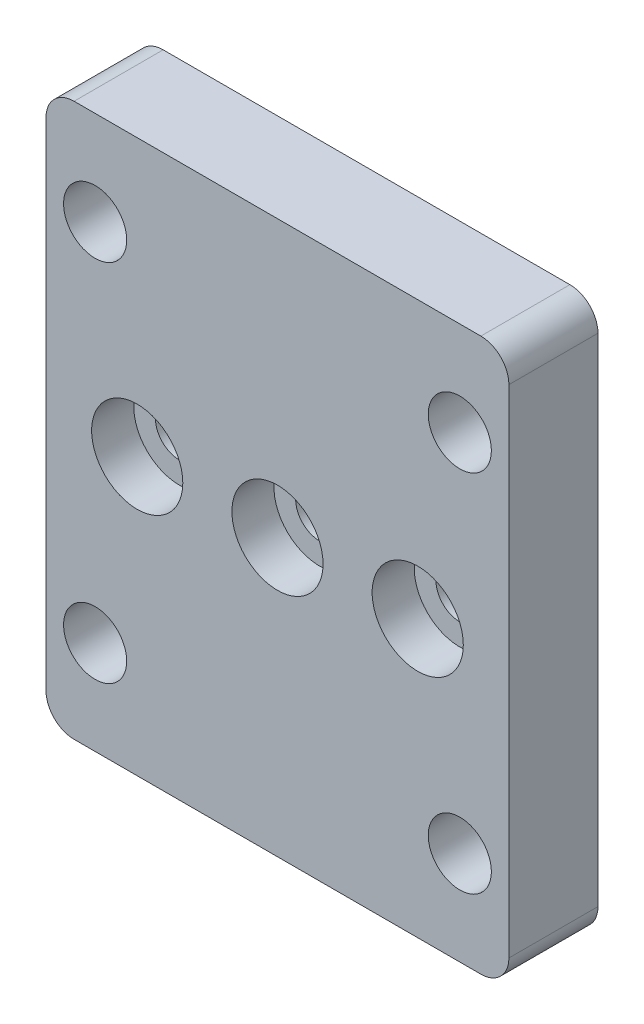
ISO-10303-21;
HEADER;
FILE_DESCRIPTION(('STEP AP214'),'2;1');
FILE_NAME('part.step','',(''),(''),'','','');
FILE_SCHEMA(('AUTOMOTIVE_DESIGN { 1 0 10303 214 1 1 1 1 }'));
ENDSEC;
DATA;
#1=APPLICATION_CONTEXT('core data for automotive mechanical design processes');
#2=APPLICATION_PROTOCOL_DEFINITION('international standard','automotive_design',2000,#1);
#3=PRODUCT_CONTEXT('',#1,'mechanical');
#4=PRODUCT('Part','Part','',(#3));
#5=PRODUCT_RELATED_PRODUCT_CATEGORY('part','',(#4));
#6=PRODUCT_DEFINITION_FORMATION('','',#4);
#7=PRODUCT_DEFINITION_CONTEXT('part definition',#1,'design');
#8=PRODUCT_DEFINITION('design','',#6,#7);
#9=PRODUCT_DEFINITION_SHAPE('','',#8);
#10=(LENGTH_UNIT() NAMED_UNIT(*) SI_UNIT(.MILLI.,.METRE.));
#11=(NAMED_UNIT(*) PLANE_ANGLE_UNIT() SI_UNIT($,.RADIAN.));
#12=(NAMED_UNIT(*) SI_UNIT($,.STERADIAN.) SOLID_ANGLE_UNIT());
#13=UNCERTAINTY_MEASURE_WITH_UNIT(LENGTH_MEASURE(1.E-05),#10,'distance_accuracy_value','');
#14=(GEOMETRIC_REPRESENTATION_CONTEXT(3) GLOBAL_UNCERTAINTY_ASSIGNED_CONTEXT((#13)) GLOBAL_UNIT_ASSIGNED_CONTEXT((#10,
#11,#12)) REPRESENTATION_CONTEXT('',''));
#15=CARTESIAN_POINT('',(0.,0.,0.));
#16=DIRECTION('',(0.,0.,1.));
#17=DIRECTION('',(1.,0.,0.));
#18=AXIS2_PLACEMENT_3D('',#15,#16,#17);
#19=CARTESIAN_POINT('',(-16.5,-19.7,6.35));
#20=DIRECTION('',(1.,0.,0.));
#21=DIRECTION('',(0.,0.,-1.));
#22=AXIS2_PLACEMENT_3D('',#19,#20,#21);
#23=PLANE('',#22);
#24=DIRECTION('',(0.,-1.,0.));
#25=VECTOR('',#24,1.);
#26=CARTESIAN_POINT('',(-16.5,-19.7,0.));
#27=LINE('',#26,#25);
#28=CARTESIAN_POINT('',(-16.5,17.7,0.));
#29=VERTEX_POINT('',#28);
#30=CARTESIAN_POINT('',(-16.5,-17.7,0.));
#31=VERTEX_POINT('',#30);
#32=EDGE_CURVE('E161',#29,#31,#27,.T.);
#33=ORIENTED_EDGE('',*,*,#32,.T.);
#34=DIRECTION('',(0.,0.,-1.));
#35=VECTOR('',#34,1.);
#36=CARTESIAN_POINT('',(-16.5,-17.7,6.35));
#37=LINE('',#36,#35);
#38=CARTESIAN_POINT('',(-16.5,-17.7,6.35));
#39=VERTEX_POINT('',#38);
#40=EDGE_CURVE('E11',#31,#39,#37,.F.);
#41=ORIENTED_EDGE('',*,*,#40,.T.);
#42=DIRECTION('',(0.,-1.,0.));
#43=VECTOR('',#42,1.);
#44=CARTESIAN_POINT('',(-16.5,-19.7,6.35));
#45=LINE('',#44,#43);
#46=CARTESIAN_POINT('',(-16.5,17.7,6.35));
#47=VERTEX_POINT('',#46);
#48=EDGE_CURVE('E129',#47,#39,#45,.T.);
#49=ORIENTED_EDGE('',*,*,#48,.F.);
#50=DIRECTION('',(0.,0.,-1.));
#51=VECTOR('',#50,1.);
#52=CARTESIAN_POINT('',(-16.5,17.7,6.35));
#53=LINE('',#52,#51);
#54=EDGE_CURVE('E45',#47,#29,#53,.T.);
#55=ORIENTED_EDGE('',*,*,#54,.T.);
#56=EDGE_LOOP('',(#33,#41,#49,#55));
#57=FACE_BOUND('',#56,.T.);
#58=ADVANCED_FACE('F37',(#57),#23,.F.);
#59=CARTESIAN_POINT('',(16.5,-19.7,6.35));
#60=DIRECTION('',(0.,1.,0.));
#61=DIRECTION('',(0.,0.,1.));
#62=AXIS2_PLACEMENT_3D('',#59,#60,#61);
#63=PLANE('',#62);
#64=DIRECTION('',(1.,0.,0.));
#65=VECTOR('',#64,1.);
#66=CARTESIAN_POINT('',(16.5,-19.7,0.));
#67=LINE('',#66,#65);
#68=CARTESIAN_POINT('',(-14.5,-19.7,0.));
#69=VERTEX_POINT('',#68);
#70=CARTESIAN_POINT('',(14.5,-19.7,0.));
#71=VERTEX_POINT('',#70);
#72=EDGE_CURVE('E134',#69,#71,#67,.T.);
#73=ORIENTED_EDGE('',*,*,#72,.T.);
#74=DIRECTION('',(0.,0.,-1.));
#75=VECTOR('',#74,1.);
#76=CARTESIAN_POINT('',(14.5,-19.7,6.35));
#77=LINE('',#76,#75);
#78=CARTESIAN_POINT('',(14.5,-19.7,6.35));
#79=VERTEX_POINT('',#78);
#80=EDGE_CURVE('E52',#71,#79,#77,.F.);
#81=ORIENTED_EDGE('',*,*,#80,.T.);
#82=DIRECTION('',(1.,0.,0.));
#83=VECTOR('',#82,1.);
#84=CARTESIAN_POINT('',(16.5,-19.7,6.35));
#85=LINE('',#84,#83);
#86=CARTESIAN_POINT('',(-14.5,-19.7,6.35));
#87=VERTEX_POINT('',#86);
#88=EDGE_CURVE('E132',#87,#79,#85,.T.);
#89=ORIENTED_EDGE('',*,*,#88,.F.);
#90=DIRECTION('',(0.,0.,-1.));
#91=VECTOR('',#90,1.);
#92=CARTESIAN_POINT('',(-14.5,-19.7,6.35));
#93=LINE('',#92,#91);
#94=EDGE_CURVE('E153',#87,#69,#93,.T.);
#95=ORIENTED_EDGE('',*,*,#94,.T.);
#96=EDGE_LOOP('',(#73,#81,#89,#95));
#97=FACE_BOUND('',#96,.T.);
#98=ADVANCED_FACE('F258',(#97),#63,.F.);
#99=CARTESIAN_POINT('',(16.5,-19.7,6.35));
#100=DIRECTION('',(-1.,0.,0.));
#101=DIRECTION('',(0.,0.,1.));
#102=AXIS2_PLACEMENT_3D('',#99,#100,#101);
#103=PLANE('',#102);
#104=DIRECTION('',(0.,1.,0.));
#105=VECTOR('',#104,1.);
#106=CARTESIAN_POINT('',(16.5,-19.7,0.));
#107=LINE('',#106,#105);
#108=CARTESIAN_POINT('',(16.5,-17.7,0.));
#109=VERTEX_POINT('',#108);
#110=CARTESIAN_POINT('',(16.5,17.7,0.));
#111=VERTEX_POINT('',#110);
#112=EDGE_CURVE('E130',#109,#111,#107,.T.);
#113=ORIENTED_EDGE('',*,*,#112,.T.);
#114=DIRECTION('',(0.,0.,-1.));
#115=VECTOR('',#114,1.);
#116=CARTESIAN_POINT('',(16.5,17.7,6.35));
#117=LINE('',#116,#115);
#118=CARTESIAN_POINT('',(16.5,17.7,6.35));
#119=VERTEX_POINT('',#118);
#120=EDGE_CURVE('E108',#111,#119,#117,.F.);
#121=ORIENTED_EDGE('',*,*,#120,.T.);
#122=DIRECTION('',(0.,1.,0.));
#123=VECTOR('',#122,1.);
#124=CARTESIAN_POINT('',(16.5,-19.7,6.35));
#125=LINE('',#124,#123);
#126=CARTESIAN_POINT('',(16.5,-17.7,6.35));
#127=VERTEX_POINT('',#126);
#128=EDGE_CURVE('E173',#127,#119,#125,.T.);
#129=ORIENTED_EDGE('',*,*,#128,.F.);
#130=DIRECTION('',(0.,0.,-1.));
#131=VECTOR('',#130,1.);
#132=CARTESIAN_POINT('',(16.5,-17.7,6.35));
#133=LINE('',#132,#131);
#134=EDGE_CURVE('E113',#127,#109,#133,.T.);
#135=ORIENTED_EDGE('',*,*,#134,.T.);
#136=EDGE_LOOP('',(#113,#121,#129,#135));
#137=FACE_BOUND('',#136,.T.);
#138=ADVANCED_FACE('F255',(#137),#103,.F.);
#139=CARTESIAN_POINT('',(16.5,19.7,6.35));
#140=DIRECTION('',(0.,-1.,0.));
#141=DIRECTION('',(1.,0.,0.));
#142=AXIS2_PLACEMENT_3D('',#139,#140,#141);
#143=PLANE('',#142);
#144=DIRECTION('',(-1.,0.,0.));
#145=VECTOR('',#144,1.);
#146=CARTESIAN_POINT('',(16.5,19.7,6.35));
#147=LINE('',#146,#145);
#148=CARTESIAN_POINT('',(14.5,19.7,6.35));
#149=VERTEX_POINT('',#148);
#150=CARTESIAN_POINT('',(-14.5,19.7,6.35));
#151=VERTEX_POINT('',#150);
#152=EDGE_CURVE('E123',#149,#151,#147,.T.);
#153=ORIENTED_EDGE('',*,*,#152,.F.);
#154=DIRECTION('',(0.,0.,-1.));
#155=VECTOR('',#154,1.);
#156=CARTESIAN_POINT('',(14.5,19.7,6.35));
#157=LINE('',#156,#155);
#158=CARTESIAN_POINT('',(14.5,19.7,0.));
#159=VERTEX_POINT('',#158);
#160=EDGE_CURVE('E107',#149,#159,#157,.T.);
#161=ORIENTED_EDGE('',*,*,#160,.T.);
#162=DIRECTION('',(-1.,0.,0.));
#163=VECTOR('',#162,1.);
#164=CARTESIAN_POINT('',(16.5,19.7,0.));
#165=LINE('',#164,#163);
#166=CARTESIAN_POINT('',(-14.5,19.7,0.));
#167=VERTEX_POINT('',#166);
#168=EDGE_CURVE('E120',#159,#167,#165,.T.);
#169=ORIENTED_EDGE('',*,*,#168,.T.);
#170=DIRECTION('',(0.,0.,-1.));
#171=VECTOR('',#170,1.);
#172=CARTESIAN_POINT('',(-14.5,19.7,6.35));
#173=LINE('',#172,#171);
#174=EDGE_CURVE('E125',#167,#151,#173,.F.);
#175=ORIENTED_EDGE('',*,*,#174,.T.);
#176=EDGE_LOOP('',(#153,#161,#169,#175));
#177=FACE_BOUND('',#176,.T.);
#178=ADVANCED_FACE('F119',(#177),#143,.F.);
#179=CARTESIAN_POINT('',(0.,0.,6.35));
#180=DIRECTION('',(0.,0.,1.));
#181=DIRECTION('',(1.,0.,0.));
#182=AXIS2_PLACEMENT_3D('',#179,#180,#181);
#183=PLANE('',#182);
#184=CARTESIAN_POINT('',(-13.,13.,6.35));
#185=DIRECTION('',(0.,0.,1.));
#186=DIRECTION('',(1.,0.,0.));
#187=AXIS2_PLACEMENT_3D('',#184,#185,#186);
#188=CIRCLE('',#187,2.25);
#189=CARTESIAN_POINT('',(-10.75,13.,6.35));
#190=VERTEX_POINT('',#189);
#191=EDGE_CURVE('E230',#190,#190,#188,.T.);
#192=ORIENTED_EDGE('',*,*,#191,.F.);
#193=EDGE_LOOP('',(#192));
#194=FACE_BOUND('',#193,.T.);
#195=CARTESIAN_POINT('',(-13.,-13.,6.35));
#196=DIRECTION('',(0.,0.,1.));
#197=DIRECTION('',(1.,0.,0.));
#198=AXIS2_PLACEMENT_3D('',#195,#196,#197);
#199=CIRCLE('',#198,2.25);
#200=CARTESIAN_POINT('',(-10.75,-13.,6.35));
#201=VERTEX_POINT('',#200);
#202=EDGE_CURVE('E224',#201,#201,#199,.T.);
#203=ORIENTED_EDGE('',*,*,#202,.F.);
#204=EDGE_LOOP('',(#203));
#205=FACE_BOUND('',#204,.T.);
#206=CARTESIAN_POINT('',(13.,-13.,6.35));
#207=DIRECTION('',(0.,0.,1.));
#208=DIRECTION('',(1.,0.,0.));
#209=AXIS2_PLACEMENT_3D('',#206,#207,#208);
#210=CIRCLE('',#209,2.25);
#211=CARTESIAN_POINT('',(15.25,-13.,6.35));
#212=VERTEX_POINT('',#211);
#213=EDGE_CURVE('E218',#212,#212,#210,.T.);
#214=ORIENTED_EDGE('',*,*,#213,.F.);
#215=EDGE_LOOP('',(#214));
#216=FACE_BOUND('',#215,.T.);
#217=CARTESIAN_POINT('',(13.,13.,6.35));
#218=DIRECTION('',(0.,0.,1.));
#219=DIRECTION('',(1.,0.,0.));
#220=AXIS2_PLACEMENT_3D('',#217,#218,#219);
#221=CIRCLE('',#220,2.25);
#222=CARTESIAN_POINT('',(15.25,13.,6.35));
#223=VERTEX_POINT('',#222);
#224=EDGE_CURVE('E212',#223,#223,#221,.T.);
#225=ORIENTED_EDGE('',*,*,#224,.F.);
#226=EDGE_LOOP('',(#225));
#227=FACE_BOUND('',#226,.T.);
#228=CARTESIAN_POINT('',(-10.,0.,6.35));
#229=DIRECTION('',(0.,0.,1.));
#230=DIRECTION('',(1.,0.,0.));
#231=AXIS2_PLACEMENT_3D('',#228,#229,#230);
#232=CIRCLE('',#231,3.25);
#233=CARTESIAN_POINT('',(-6.75,0.,6.35));
#234=VERTEX_POINT('',#233);
#235=EDGE_CURVE('E206',#234,#234,#232,.T.);
#236=ORIENTED_EDGE('',*,*,#235,.F.);
#237=EDGE_LOOP('',(#236));
#238=FACE_BOUND('',#237,.T.);
#239=CARTESIAN_POINT('',(0.,0.,6.35));
#240=DIRECTION('',(0.,0.,1.));
#241=DIRECTION('',(1.,0.,0.));
#242=AXIS2_PLACEMENT_3D('',#239,#240,#241);
#243=CIRCLE('',#242,3.25);
#244=CARTESIAN_POINT('',(3.25,0.,6.35));
#245=VERTEX_POINT('',#244);
#246=EDGE_CURVE('E194',#245,#245,#243,.T.);
#247=ORIENTED_EDGE('',*,*,#246,.F.);
#248=EDGE_LOOP('',(#247));
#249=FACE_BOUND('',#248,.T.);
#250=CARTESIAN_POINT('',(10.,0.,6.35));
#251=DIRECTION('',(0.,0.,1.));
#252=DIRECTION('',(1.,0.,0.));
#253=AXIS2_PLACEMENT_3D('',#250,#251,#252);
#254=CIRCLE('',#253,3.25);
#255=CARTESIAN_POINT('',(13.25,0.,6.35));
#256=VERTEX_POINT('',#255);
#257=EDGE_CURVE('E182',#256,#256,#254,.T.);
#258=ORIENTED_EDGE('',*,*,#257,.F.);
#259=EDGE_LOOP('',(#258));
#260=FACE_BOUND('',#259,.T.);
#261=ORIENTED_EDGE('',*,*,#128,.T.);
#262=CARTESIAN_POINT('',(14.5,17.7,6.35));
#263=DIRECTION('',(0.,0.,1.));
#264=DIRECTION('',(1.,0.,0.));
#265=AXIS2_PLACEMENT_3D('',#262,#263,#264);
#266=CIRCLE('',#265,2.);
#267=EDGE_CURVE('E151',#119,#149,#266,.T.);
#268=ORIENTED_EDGE('',*,*,#267,.T.);
#269=ORIENTED_EDGE('',*,*,#152,.T.);
#270=CARTESIAN_POINT('',(-14.5,17.7,6.35));
#271=DIRECTION('',(0.,0.,1.));
#272=DIRECTION('',(1.,0.,0.));
#273=AXIS2_PLACEMENT_3D('',#270,#271,#272);
#274=CIRCLE('',#273,2.);
#275=EDGE_CURVE('E146',#151,#47,#274,.T.);
#276=ORIENTED_EDGE('',*,*,#275,.T.);
#277=ORIENTED_EDGE('',*,*,#48,.T.);
#278=CARTESIAN_POINT('',(-14.5,-17.7,6.35));
#279=DIRECTION('',(0.,0.,1.));
#280=DIRECTION('',(1.,0.,0.));
#281=AXIS2_PLACEMENT_3D('',#278,#279,#280);
#282=CIRCLE('',#281,2.);
#283=EDGE_CURVE('E59',#39,#87,#282,.T.);
#284=ORIENTED_EDGE('',*,*,#283,.T.);
#285=ORIENTED_EDGE('',*,*,#88,.T.);
#286=CARTESIAN_POINT('',(14.5,-17.7,6.35));
#287=DIRECTION('',(0.,0.,1.));
#288=DIRECTION('',(1.,0.,0.));
#289=AXIS2_PLACEMENT_3D('',#286,#287,#288);
#290=CIRCLE('',#289,2.);
#291=EDGE_CURVE('E149',#79,#127,#290,.T.);
#292=ORIENTED_EDGE('',*,*,#291,.T.);
#293=EDGE_LOOP('',(#261,#268,#269,#276,#277,#284,#285,#292));
#294=FACE_BOUND('',#293,.T.);
#295=ADVANCED_FACE('F236',(#194,#205,#216,#227,#238,#249,#260,#294),#183,.T.);
#296=CARTESIAN_POINT('',(0.,0.,0.));
#297=DIRECTION('',(0.,0.,1.));
#298=DIRECTION('',(1.,0.,0.));
#299=AXIS2_PLACEMENT_3D('',#296,#297,#298);
#300=PLANE('',#299);
#301=CARTESIAN_POINT('',(-13.,13.,0.));
#302=DIRECTION('',(0.,0.,1.));
#303=DIRECTION('',(1.,0.,0.));
#304=AXIS2_PLACEMENT_3D('',#301,#302,#303);
#305=CIRCLE('',#304,2.25);
#306=CARTESIAN_POINT('',(-10.75,13.,0.));
#307=VERTEX_POINT('',#306);
#308=EDGE_CURVE('E227',#307,#307,#305,.T.);
#309=ORIENTED_EDGE('',*,*,#308,.T.);
#310=EDGE_LOOP('',(#309));
#311=FACE_BOUND('',#310,.T.);
#312=CARTESIAN_POINT('',(-13.,-13.,0.));
#313=DIRECTION('',(0.,0.,1.));
#314=DIRECTION('',(1.,0.,0.));
#315=AXIS2_PLACEMENT_3D('',#312,#313,#314);
#316=CIRCLE('',#315,2.25);
#317=CARTESIAN_POINT('',(-10.75,-13.,0.));
#318=VERTEX_POINT('',#317);
#319=EDGE_CURVE('E221',#318,#318,#316,.T.);
#320=ORIENTED_EDGE('',*,*,#319,.T.);
#321=EDGE_LOOP('',(#320));
#322=FACE_BOUND('',#321,.T.);
#323=CARTESIAN_POINT('',(13.,-13.,0.));
#324=DIRECTION('',(0.,0.,1.));
#325=DIRECTION('',(1.,0.,0.));
#326=AXIS2_PLACEMENT_3D('',#323,#324,#325);
#327=CIRCLE('',#326,2.25);
#328=CARTESIAN_POINT('',(15.25,-13.,0.));
#329=VERTEX_POINT('',#328);
#330=EDGE_CURVE('E215',#329,#329,#327,.T.);
#331=ORIENTED_EDGE('',*,*,#330,.T.);
#332=EDGE_LOOP('',(#331));
#333=FACE_BOUND('',#332,.T.);
#334=CARTESIAN_POINT('',(13.,13.,0.));
#335=DIRECTION('',(0.,0.,1.));
#336=DIRECTION('',(1.,0.,0.));
#337=AXIS2_PLACEMENT_3D('',#334,#335,#336);
#338=CIRCLE('',#337,2.25);
#339=CARTESIAN_POINT('',(15.25,13.,0.));
#340=VERTEX_POINT('',#339);
#341=EDGE_CURVE('E209',#340,#340,#338,.T.);
#342=ORIENTED_EDGE('',*,*,#341,.T.);
#343=EDGE_LOOP('',(#342));
#344=FACE_BOUND('',#343,.T.);
#345=CARTESIAN_POINT('',(-10.,0.,0.));
#346=DIRECTION('',(0.,0.,1.));
#347=DIRECTION('',(1.,0.,0.));
#348=AXIS2_PLACEMENT_3D('',#345,#346,#347);
#349=CIRCLE('',#348,1.7);
#350=CARTESIAN_POINT('',(-8.3,0.,0.));
#351=VERTEX_POINT('',#350);
#352=EDGE_CURVE('E197',#351,#351,#349,.T.);
#353=ORIENTED_EDGE('',*,*,#352,.T.);
#354=EDGE_LOOP('',(#353));
#355=FACE_BOUND('',#354,.T.);
#356=CARTESIAN_POINT('',(0.,0.,0.));
#357=DIRECTION('',(0.,0.,1.));
#358=DIRECTION('',(1.,0.,0.));
#359=AXIS2_PLACEMENT_3D('',#356,#357,#358);
#360=CIRCLE('',#359,1.7);
#361=CARTESIAN_POINT('',(1.7,0.,0.));
#362=VERTEX_POINT('',#361);
#363=EDGE_CURVE('E185',#362,#362,#360,.T.);
#364=ORIENTED_EDGE('',*,*,#363,.T.);
#365=EDGE_LOOP('',(#364));
#366=FACE_BOUND('',#365,.T.);
#367=CARTESIAN_POINT('',(10.,0.,0.));
#368=DIRECTION('',(0.,0.,1.));
#369=DIRECTION('',(1.,0.,0.));
#370=AXIS2_PLACEMENT_3D('',#367,#368,#369);
#371=CIRCLE('',#370,1.7);
#372=CARTESIAN_POINT('',(11.7,0.,0.));
#373=VERTEX_POINT('',#372);
#374=EDGE_CURVE('E166',#373,#373,#371,.T.);
#375=ORIENTED_EDGE('',*,*,#374,.T.);
#376=EDGE_LOOP('',(#375));
#377=FACE_BOUND('',#376,.T.);
#378=ORIENTED_EDGE('',*,*,#168,.F.);
#379=CARTESIAN_POINT('',(14.5,17.7,0.));
#380=DIRECTION('',(0.,0.,1.));
#381=DIRECTION('',(1.,0.,0.));
#382=AXIS2_PLACEMENT_3D('',#379,#380,#381);
#383=CIRCLE('',#382,2.);
#384=EDGE_CURVE('E103',#159,#111,#383,.F.);
#385=ORIENTED_EDGE('',*,*,#384,.T.);
#386=ORIENTED_EDGE('',*,*,#112,.F.);
#387=CARTESIAN_POINT('',(14.5,-17.7,0.));
#388=DIRECTION('',(0.,0.,1.));
#389=DIRECTION('',(1.,0.,0.));
#390=AXIS2_PLACEMENT_3D('',#387,#388,#389);
#391=CIRCLE('',#390,2.);
#392=EDGE_CURVE('E114',#109,#71,#391,.F.);
#393=ORIENTED_EDGE('',*,*,#392,.T.);
#394=ORIENTED_EDGE('',*,*,#72,.F.);
#395=CARTESIAN_POINT('',(-14.5,-17.7,0.));
#396=DIRECTION('',(0.,0.,1.));
#397=DIRECTION('',(1.,0.,0.));
#398=AXIS2_PLACEMENT_3D('',#395,#396,#397);
#399=CIRCLE('',#398,2.);
#400=EDGE_CURVE('E140',#69,#31,#399,.F.);
#401=ORIENTED_EDGE('',*,*,#400,.T.);
#402=ORIENTED_EDGE('',*,*,#32,.F.);
#403=CARTESIAN_POINT('',(-14.5,17.7,0.));
#404=DIRECTION('',(0.,0.,1.));
#405=DIRECTION('',(1.,0.,0.));
#406=AXIS2_PLACEMENT_3D('',#403,#404,#405);
#407=CIRCLE('',#406,2.);
#408=EDGE_CURVE('E124',#29,#167,#407,.F.);
#409=ORIENTED_EDGE('',*,*,#408,.T.);
#410=EDGE_LOOP('',(#378,#385,#386,#393,#394,#401,#402,#409));
#411=FACE_BOUND('',#410,.T.);
#412=ADVANCED_FACE('F127',(#311,#322,#333,#344,#355,#366,#377,#411),#300,.F.);
#413=CARTESIAN_POINT('',(10.,0.,6.35));
#414=DIRECTION('',(0.,0.,1.));
#415=DIRECTION('',(1.,0.,0.));
#416=AXIS2_PLACEMENT_3D('',#413,#414,#415);
#417=CYLINDRICAL_SURFACE('',#416,1.7);
#418=ORIENTED_EDGE('',*,*,#374,.F.);
#419=EDGE_LOOP('',(#418));
#420=FACE_BOUND('',#419,.T.);
#421=CARTESIAN_POINT('',(10.,0.,3.35));
#422=DIRECTION('',(0.,0.,1.));
#423=DIRECTION('',(1.,0.,0.));
#424=AXIS2_PLACEMENT_3D('',#421,#422,#423);
#425=CIRCLE('',#424,1.7);
#426=CARTESIAN_POINT('',(11.7,0.,3.35));
#427=VERTEX_POINT('',#426);
#428=EDGE_CURVE('E169',#427,#427,#425,.T.);
#429=ORIENTED_EDGE('',*,*,#428,.T.);
#430=EDGE_LOOP('',(#429));
#431=FACE_BOUND('',#430,.T.);
#432=ADVANCED_FACE('F421',(#420,#431),#417,.F.);
#433=CARTESIAN_POINT('',(11.7,0.,3.35));
#434=DIRECTION('',(0.,0.,-1.));
#435=DIRECTION('',(-1.,0.,0.));
#436=AXIS2_PLACEMENT_3D('',#433,#434,#435);
#437=PLANE('',#436);
#438=ORIENTED_EDGE('',*,*,#428,.F.);
#439=EDGE_LOOP('',(#438));
#440=FACE_BOUND('',#439,.T.);
#441=CARTESIAN_POINT('',(10.,0.,3.35));
#442=DIRECTION('',(0.,0.,1.));
#443=DIRECTION('',(1.,0.,0.));
#444=AXIS2_PLACEMENT_3D('',#441,#442,#443);
#445=CIRCLE('',#444,3.25);
#446=CARTESIAN_POINT('',(13.25,0.,3.35));
#447=VERTEX_POINT('',#446);
#448=EDGE_CURVE('E179',#447,#447,#445,.T.);
#449=ORIENTED_EDGE('',*,*,#448,.T.);
#450=EDGE_LOOP('',(#449));
#451=FACE_BOUND('',#450,.T.);
#452=ADVANCED_FACE('F411',(#440,#451),#437,.F.);
#453=CARTESIAN_POINT('',(10.,0.,6.35));
#454=DIRECTION('',(0.,0.,1.));
#455=DIRECTION('',(1.,0.,0.));
#456=AXIS2_PLACEMENT_3D('',#453,#454,#455);
#457=CYLINDRICAL_SURFACE('',#456,3.25);
#458=ORIENTED_EDGE('',*,*,#448,.F.);
#459=EDGE_LOOP('',(#458));
#460=FACE_BOUND('',#459,.T.);
#461=ORIENTED_EDGE('',*,*,#257,.T.);
#462=EDGE_LOOP('',(#461));
#463=FACE_BOUND('',#462,.T.);
#464=ADVANCED_FACE('F401',(#460,#463),#457,.F.);
#465=CARTESIAN_POINT('',(0.,0.,6.35));
#466=DIRECTION('',(0.,0.,1.));
#467=DIRECTION('',(1.,0.,0.));
#468=AXIS2_PLACEMENT_3D('',#465,#466,#467);
#469=CYLINDRICAL_SURFACE('',#468,1.7);
#470=ORIENTED_EDGE('',*,*,#363,.F.);
#471=EDGE_LOOP('',(#470));
#472=FACE_BOUND('',#471,.T.);
#473=CARTESIAN_POINT('',(0.,0.,3.35));
#474=DIRECTION('',(0.,0.,1.));
#475=DIRECTION('',(1.,0.,0.));
#476=AXIS2_PLACEMENT_3D('',#473,#474,#475);
#477=CIRCLE('',#476,1.7);
#478=CARTESIAN_POINT('',(1.7,0.,3.35));
#479=VERTEX_POINT('',#478);
#480=EDGE_CURVE('E188',#479,#479,#477,.T.);
#481=ORIENTED_EDGE('',*,*,#480,.T.);
#482=EDGE_LOOP('',(#481));
#483=FACE_BOUND('',#482,.T.);
#484=ADVANCED_FACE('F391',(#472,#483),#469,.F.);
#485=CARTESIAN_POINT('',(1.7,0.,3.35));
#486=DIRECTION('',(0.,0.,-1.));
#487=DIRECTION('',(-1.,0.,0.));
#488=AXIS2_PLACEMENT_3D('',#485,#486,#487);
#489=PLANE('',#488);
#490=ORIENTED_EDGE('',*,*,#480,.F.);
#491=EDGE_LOOP('',(#490));
#492=FACE_BOUND('',#491,.T.);
#493=CARTESIAN_POINT('',(0.,0.,3.35));
#494=DIRECTION('',(0.,0.,1.));
#495=DIRECTION('',(1.,0.,0.));
#496=AXIS2_PLACEMENT_3D('',#493,#494,#495);
#497=CIRCLE('',#496,3.25);
#498=CARTESIAN_POINT('',(3.25,0.,3.35));
#499=VERTEX_POINT('',#498);
#500=EDGE_CURVE('E191',#499,#499,#497,.T.);
#501=ORIENTED_EDGE('',*,*,#500,.T.);
#502=EDGE_LOOP('',(#501));
#503=FACE_BOUND('',#502,.T.);
#504=ADVANCED_FACE('F381',(#492,#503),#489,.F.);
#505=CARTESIAN_POINT('',(0.,0.,6.35));
#506=DIRECTION('',(0.,0.,1.));
#507=DIRECTION('',(1.,0.,0.));
#508=AXIS2_PLACEMENT_3D('',#505,#506,#507);
#509=CYLINDRICAL_SURFACE('',#508,3.25);
#510=ORIENTED_EDGE('',*,*,#500,.F.);
#511=EDGE_LOOP('',(#510));
#512=FACE_BOUND('',#511,.T.);
#513=ORIENTED_EDGE('',*,*,#246,.T.);
#514=EDGE_LOOP('',(#513));
#515=FACE_BOUND('',#514,.T.);
#516=ADVANCED_FACE('F371',(#512,#515),#509,.F.);
#517=CARTESIAN_POINT('',(-10.,0.,6.35));
#518=DIRECTION('',(0.,0.,1.));
#519=DIRECTION('',(1.,0.,0.));
#520=AXIS2_PLACEMENT_3D('',#517,#518,#519);
#521=CYLINDRICAL_SURFACE('',#520,1.7);
#522=ORIENTED_EDGE('',*,*,#352,.F.);
#523=EDGE_LOOP('',(#522));
#524=FACE_BOUND('',#523,.T.);
#525=CARTESIAN_POINT('',(-10.,0.,3.35));
#526=DIRECTION('',(0.,0.,1.));
#527=DIRECTION('',(1.,0.,0.));
#528=AXIS2_PLACEMENT_3D('',#525,#526,#527);
#529=CIRCLE('',#528,1.7);
#530=CARTESIAN_POINT('',(-8.3,0.,3.35));
#531=VERTEX_POINT('',#530);
#532=EDGE_CURVE('E200',#531,#531,#529,.T.);
#533=ORIENTED_EDGE('',*,*,#532,.T.);
#534=EDGE_LOOP('',(#533));
#535=FACE_BOUND('',#534,.T.);
#536=ADVANCED_FACE('F361',(#524,#535),#521,.F.);
#537=CARTESIAN_POINT('',(-8.3,0.,3.35));
#538=DIRECTION('',(0.,0.,-1.));
#539=DIRECTION('',(-1.,0.,0.));
#540=AXIS2_PLACEMENT_3D('',#537,#538,#539);
#541=PLANE('',#540);
#542=ORIENTED_EDGE('',*,*,#532,.F.);
#543=EDGE_LOOP('',(#542));
#544=FACE_BOUND('',#543,.T.);
#545=CARTESIAN_POINT('',(-10.,0.,3.35));
#546=DIRECTION('',(0.,0.,1.));
#547=DIRECTION('',(1.,0.,0.));
#548=AXIS2_PLACEMENT_3D('',#545,#546,#547);
#549=CIRCLE('',#548,3.25);
#550=CARTESIAN_POINT('',(-6.75,0.,3.35));
#551=VERTEX_POINT('',#550);
#552=EDGE_CURVE('E203',#551,#551,#549,.T.);
#553=ORIENTED_EDGE('',*,*,#552,.T.);
#554=EDGE_LOOP('',(#553));
#555=FACE_BOUND('',#554,.T.);
#556=ADVANCED_FACE('F351',(#544,#555),#541,.F.);
#557=CARTESIAN_POINT('',(-10.,0.,6.35));
#558=DIRECTION('',(0.,0.,1.));
#559=DIRECTION('',(1.,0.,0.));
#560=AXIS2_PLACEMENT_3D('',#557,#558,#559);
#561=CYLINDRICAL_SURFACE('',#560,3.25);
#562=ORIENTED_EDGE('',*,*,#552,.F.);
#563=EDGE_LOOP('',(#562));
#564=FACE_BOUND('',#563,.T.);
#565=ORIENTED_EDGE('',*,*,#235,.T.);
#566=EDGE_LOOP('',(#565));
#567=FACE_BOUND('',#566,.T.);
#568=ADVANCED_FACE('F341',(#564,#567),#561,.F.);
#569=CARTESIAN_POINT('',(13.,13.,6.35));
#570=DIRECTION('',(0.,0.,1.));
#571=DIRECTION('',(1.,0.,0.));
#572=AXIS2_PLACEMENT_3D('',#569,#570,#571);
#573=CYLINDRICAL_SURFACE('',#572,2.25);
#574=ORIENTED_EDGE('',*,*,#341,.F.);
#575=EDGE_LOOP('',(#574));
#576=FACE_BOUND('',#575,.T.);
#577=ORIENTED_EDGE('',*,*,#224,.T.);
#578=EDGE_LOOP('',(#577));
#579=FACE_BOUND('',#578,.T.);
#580=ADVANCED_FACE('F331',(#576,#579),#573,.F.);
#581=CARTESIAN_POINT('',(13.,-13.,6.35));
#582=DIRECTION('',(0.,0.,1.));
#583=DIRECTION('',(1.,0.,0.));
#584=AXIS2_PLACEMENT_3D('',#581,#582,#583);
#585=CYLINDRICAL_SURFACE('',#584,2.25);
#586=ORIENTED_EDGE('',*,*,#330,.F.);
#587=EDGE_LOOP('',(#586));
#588=FACE_BOUND('',#587,.T.);
#589=ORIENTED_EDGE('',*,*,#213,.T.);
#590=EDGE_LOOP('',(#589));
#591=FACE_BOUND('',#590,.T.);
#592=ADVANCED_FACE('F321',(#588,#591),#585,.F.);
#593=CARTESIAN_POINT('',(-13.,-13.,6.35));
#594=DIRECTION('',(0.,0.,1.));
#595=DIRECTION('',(1.,0.,0.));
#596=AXIS2_PLACEMENT_3D('',#593,#594,#595);
#597=CYLINDRICAL_SURFACE('',#596,2.25);
#598=ORIENTED_EDGE('',*,*,#319,.F.);
#599=EDGE_LOOP('',(#598));
#600=FACE_BOUND('',#599,.T.);
#601=ORIENTED_EDGE('',*,*,#202,.T.);
#602=EDGE_LOOP('',(#601));
#603=FACE_BOUND('',#602,.T.);
#604=ADVANCED_FACE('F312',(#600,#603),#597,.F.);
#605=CARTESIAN_POINT('',(-13.,13.,6.35));
#606=DIRECTION('',(0.,0.,1.));
#607=DIRECTION('',(1.,0.,0.));
#608=AXIS2_PLACEMENT_3D('',#605,#606,#607);
#609=CYLINDRICAL_SURFACE('',#608,2.25);
#610=ORIENTED_EDGE('',*,*,#308,.F.);
#611=EDGE_LOOP('',(#610));
#612=FACE_BOUND('',#611,.T.);
#613=ORIENTED_EDGE('',*,*,#191,.T.);
#614=EDGE_LOOP('',(#613));
#615=FACE_BOUND('',#614,.T.);
#616=ADVANCED_FACE('F234',(#612,#615),#609,.F.);
#617=CARTESIAN_POINT('',(14.5,17.7,6.35));
#618=DIRECTION('',(0.,0.,-1.));
#619=DIRECTION('',(-1.,0.,0.));
#620=AXIS2_PLACEMENT_3D('',#617,#618,#619);
#621=CYLINDRICAL_SURFACE('',#620,2.);
#622=ORIENTED_EDGE('',*,*,#267,.F.);
#623=ORIENTED_EDGE('',*,*,#120,.F.);
#624=ORIENTED_EDGE('',*,*,#384,.F.);
#625=ORIENTED_EDGE('',*,*,#160,.F.);
#626=EDGE_LOOP('',(#622,#623,#624,#625));
#627=FACE_BOUND('',#626,.T.);
#628=ADVANCED_FACE('F106',(#627),#621,.T.);
#629=CARTESIAN_POINT('',(14.5,-17.7,6.35));
#630=DIRECTION('',(0.,0.,-1.));
#631=DIRECTION('',(-1.,0.,0.));
#632=AXIS2_PLACEMENT_3D('',#629,#630,#631);
#633=CYLINDRICAL_SURFACE('',#632,2.);
#634=ORIENTED_EDGE('',*,*,#291,.F.);
#635=ORIENTED_EDGE('',*,*,#80,.F.);
#636=ORIENTED_EDGE('',*,*,#392,.F.);
#637=ORIENTED_EDGE('',*,*,#134,.F.);
#638=EDGE_LOOP('',(#634,#635,#636,#637));
#639=FACE_BOUND('',#638,.T.);
#640=ADVANCED_FACE('F257',(#639),#633,.T.);
#641=CARTESIAN_POINT('',(-14.5,-17.7,6.35));
#642=DIRECTION('',(0.,0.,-1.));
#643=DIRECTION('',(-1.,0.,0.));
#644=AXIS2_PLACEMENT_3D('',#641,#642,#643);
#645=CYLINDRICAL_SURFACE('',#644,2.);
#646=ORIENTED_EDGE('',*,*,#283,.F.);
#647=ORIENTED_EDGE('',*,*,#40,.F.);
#648=ORIENTED_EDGE('',*,*,#400,.F.);
#649=ORIENTED_EDGE('',*,*,#94,.F.);
#650=EDGE_LOOP('',(#646,#647,#648,#649));
#651=FACE_BOUND('',#650,.T.);
#652=ADVANCED_FACE('F261',(#651),#645,.T.);
#653=CARTESIAN_POINT('',(-14.5,17.7,6.35));
#654=DIRECTION('',(0.,0.,-1.));
#655=DIRECTION('',(-1.,0.,0.));
#656=AXIS2_PLACEMENT_3D('',#653,#654,#655);
#657=CYLINDRICAL_SURFACE('',#656,2.);
#658=ORIENTED_EDGE('',*,*,#275,.F.);
#659=ORIENTED_EDGE('',*,*,#174,.F.);
#660=ORIENTED_EDGE('',*,*,#408,.F.);
#661=ORIENTED_EDGE('',*,*,#54,.F.);
#662=EDGE_LOOP('',(#658,#659,#660,#661));
#663=FACE_BOUND('',#662,.T.);
#664=ADVANCED_FACE('F39',(#663),#657,.T.);
#665=CLOSED_SHELL('',(#58,#98,#138,#178,#295,#412,#432,#452,#464,#484,#504,#516,#536,#556,#568,
#580,#592,#604,#616,#628,#640,#652,#664));
#666=MANIFOLD_SOLID_BREP('B2',#665);
#667=ADVANCED_BREP_SHAPE_REPRESENTATION('',(#18,#666),#14);
#668=SHAPE_DEFINITION_REPRESENTATION(#9,#667);
ENDSEC;
END-ISO-10303-21;
